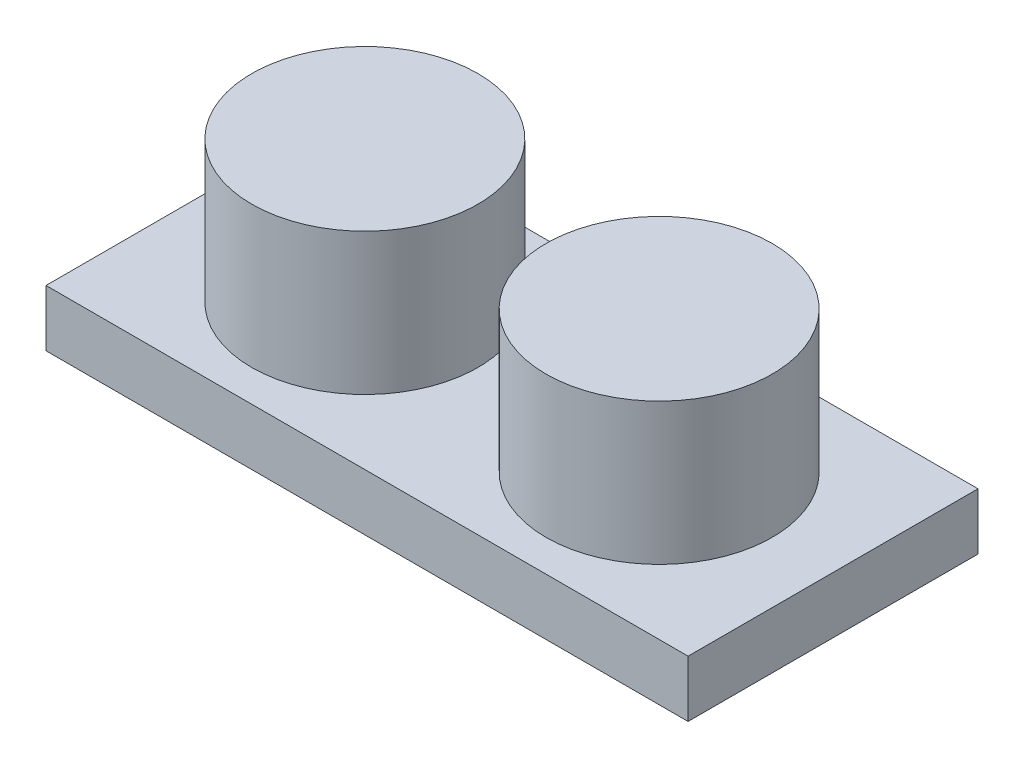
ISO-10303-21;
HEADER;
FILE_DESCRIPTION(('STEP AP214'),'2;1');
FILE_NAME('part.step','',(''),(''),'','','');
FILE_SCHEMA(('AUTOMOTIVE_DESIGN { 1 0 10303 214 1 1 1 1 }'));
ENDSEC;
DATA;
#1=APPLICATION_CONTEXT('core data for automotive mechanical design processes');
#2=APPLICATION_PROTOCOL_DEFINITION('international standard','automotive_design',2000,#1);
#3=PRODUCT_CONTEXT('',#1,'mechanical');
#4=PRODUCT('Part','Part','',(#3));
#5=PRODUCT_RELATED_PRODUCT_CATEGORY('part','',(#4));
#6=PRODUCT_DEFINITION_FORMATION('','',#4);
#7=PRODUCT_DEFINITION_CONTEXT('part definition',#1,'design');
#8=PRODUCT_DEFINITION('design','',#6,#7);
#9=PRODUCT_DEFINITION_SHAPE('','',#8);
#10=(LENGTH_UNIT() NAMED_UNIT(*) SI_UNIT(.MILLI.,.METRE.));
#11=(NAMED_UNIT(*) PLANE_ANGLE_UNIT() SI_UNIT($,.RADIAN.));
#12=(NAMED_UNIT(*) SI_UNIT($,.STERADIAN.) SOLID_ANGLE_UNIT());
#13=UNCERTAINTY_MEASURE_WITH_UNIT(LENGTH_MEASURE(1.E-05),#10,'distance_accuracy_value','');
#14=(GEOMETRIC_REPRESENTATION_CONTEXT(3) GLOBAL_UNCERTAINTY_ASSIGNED_CONTEXT((#13)) GLOBAL_UNIT_ASSIGNED_CONTEXT((#10,
#11,#12)) REPRESENTATION_CONTEXT('',''));
#15=CARTESIAN_POINT('',(0.,0.,0.));
#16=DIRECTION('',(0.,0.,1.));
#17=DIRECTION('',(1.,0.,0.));
#18=AXIS2_PLACEMENT_3D('',#15,#16,#17);
#19=CARTESIAN_POINT('',(0.,4.,-10.25));
#20=DIRECTION('',(0.,0.,-1.));
#21=DIRECTION('',(-1.,0.,0.));
#22=AXIS2_PLACEMENT_3D('',#19,#20,#21);
#23=PLANE('',#22);
#24=DIRECTION('',(1.,0.,0.));
#25=VECTOR('',#24,1.);
#26=CARTESIAN_POINT('',(0.,0.,-10.25));
#27=LINE('',#26,#25);
#28=CARTESIAN_POINT('',(-22.7,0.,-10.25));
#29=VERTEX_POINT('',#28);
#30=CARTESIAN_POINT('',(22.7,0.,-10.25));
#31=VERTEX_POINT('',#30);
#32=EDGE_CURVE('E118',#29,#31,#27,.T.);
#33=ORIENTED_EDGE('',*,*,#32,.F.);
#34=DIRECTION('',(0.,-1.,0.));
#35=VECTOR('',#34,1.);
#36=CARTESIAN_POINT('',(-22.7,4.,-10.25));
#37=LINE('',#36,#35);
#38=CARTESIAN_POINT('',(-22.7,4.,-10.25));
#39=VERTEX_POINT('',#38);
#40=EDGE_CURVE('E113',#39,#29,#37,.T.);
#41=ORIENTED_EDGE('',*,*,#40,.F.);
#42=DIRECTION('',(1.,0.,0.));
#43=VECTOR('',#42,1.);
#44=CARTESIAN_POINT('',(0.,4.,-10.25));
#45=LINE('',#44,#43);
#46=CARTESIAN_POINT('',(22.7,4.,-10.25));
#47=VERTEX_POINT('',#46);
#48=EDGE_CURVE('E116',#39,#47,#45,.T.);
#49=ORIENTED_EDGE('',*,*,#48,.T.);
#50=DIRECTION('',(0.,-1.,0.));
#51=VECTOR('',#50,1.);
#52=CARTESIAN_POINT('',(22.7,4.,-10.25));
#53=LINE('',#52,#51);
#54=EDGE_CURVE('E74',#47,#31,#53,.T.);
#55=ORIENTED_EDGE('',*,*,#54,.T.);
#56=EDGE_LOOP('',(#33,#41,#49,#55));
#57=FACE_BOUND('',#56,.T.);
#58=ADVANCED_FACE('F65',(#57),#23,.T.);
#59=CARTESIAN_POINT('',(-22.7,4.,0.));
#60=DIRECTION('',(1.,0.,0.));
#61=DIRECTION('',(0.,0.,-1.));
#62=AXIS2_PLACEMENT_3D('',#59,#60,#61);
#63=PLANE('',#62);
#64=DIRECTION('',(0.,0.,1.));
#65=VECTOR('',#64,1.);
#66=CARTESIAN_POINT('',(-22.7,0.,0.));
#67=LINE('',#66,#65);
#68=CARTESIAN_POINT('',(-22.7,0.,10.25));
#69=VERTEX_POINT('',#68);
#70=EDGE_CURVE('E98',#29,#69,#67,.T.);
#71=ORIENTED_EDGE('',*,*,#70,.T.);
#72=DIRECTION('',(0.,-1.,0.));
#73=VECTOR('',#72,1.);
#74=CARTESIAN_POINT('',(-22.7,4.,10.25));
#75=LINE('',#74,#73);
#76=CARTESIAN_POINT('',(-22.7,4.,10.25));
#77=VERTEX_POINT('',#76);
#78=EDGE_CURVE('E119',#77,#69,#75,.T.);
#79=ORIENTED_EDGE('',*,*,#78,.F.);
#80=DIRECTION('',(0.,0.,1.));
#81=VECTOR('',#80,1.);
#82=CARTESIAN_POINT('',(-22.7,4.,0.));
#83=LINE('',#82,#81);
#84=EDGE_CURVE('E121',#39,#77,#83,.T.);
#85=ORIENTED_EDGE('',*,*,#84,.F.);
#86=ORIENTED_EDGE('',*,*,#40,.T.);
#87=EDGE_LOOP('',(#71,#79,#85,#86));
#88=FACE_BOUND('',#87,.T.);
#89=ADVANCED_FACE('F122',(#88),#63,.F.);
#90=CARTESIAN_POINT('',(0.,4.,10.25));
#91=DIRECTION('',(0.,0.,-1.));
#92=DIRECTION('',(-1.,0.,0.));
#93=AXIS2_PLACEMENT_3D('',#90,#91,#92);
#94=PLANE('',#93);
#95=DIRECTION('',(1.,0.,0.));
#96=VECTOR('',#95,1.);
#97=CARTESIAN_POINT('',(0.,0.,10.25));
#98=LINE('',#97,#96);
#99=CARTESIAN_POINT('',(22.7,0.,10.25));
#100=VERTEX_POINT('',#99);
#101=EDGE_CURVE('E127',#69,#100,#98,.T.);
#102=ORIENTED_EDGE('',*,*,#101,.T.);
#103=DIRECTION('',(0.,-1.,0.));
#104=VECTOR('',#103,1.);
#105=CARTESIAN_POINT('',(22.7,4.,10.25));
#106=LINE('',#105,#104);
#107=CARTESIAN_POINT('',(22.7,4.,10.25));
#108=VERTEX_POINT('',#107);
#109=EDGE_CURVE('E105',#108,#100,#106,.T.);
#110=ORIENTED_EDGE('',*,*,#109,.F.);
#111=DIRECTION('',(1.,0.,0.));
#112=VECTOR('',#111,1.);
#113=CARTESIAN_POINT('',(0.,4.,10.25));
#114=LINE('',#113,#112);
#115=EDGE_CURVE('E82',#77,#108,#114,.T.);
#116=ORIENTED_EDGE('',*,*,#115,.F.);
#117=ORIENTED_EDGE('',*,*,#78,.T.);
#118=EDGE_LOOP('',(#102,#110,#116,#117));
#119=FACE_BOUND('',#118,.T.);
#120=ADVANCED_FACE('F168',(#119),#94,.F.);
#121=CARTESIAN_POINT('',(22.7,4.,0.));
#122=DIRECTION('',(1.,0.,0.));
#123=DIRECTION('',(0.,0.,-1.));
#124=AXIS2_PLACEMENT_3D('',#121,#122,#123);
#125=PLANE('',#124);
#126=DIRECTION('',(0.,0.,1.));
#127=VECTOR('',#126,1.);
#128=CARTESIAN_POINT('',(22.7,0.,0.));
#129=LINE('',#128,#127);
#130=EDGE_CURVE('E132',#31,#100,#129,.T.);
#131=ORIENTED_EDGE('',*,*,#130,.F.);
#132=ORIENTED_EDGE('',*,*,#54,.F.);
#133=DIRECTION('',(0.,0.,1.));
#134=VECTOR('',#133,1.);
#135=CARTESIAN_POINT('',(22.7,4.,0.));
#136=LINE('',#135,#134);
#137=EDGE_CURVE('E125',#47,#108,#136,.T.);
#138=ORIENTED_EDGE('',*,*,#137,.T.);
#139=ORIENTED_EDGE('',*,*,#109,.T.);
#140=EDGE_LOOP('',(#131,#132,#138,#139));
#141=FACE_BOUND('',#140,.T.);
#142=ADVANCED_FACE('F67',(#141),#125,.T.);
#143=CARTESIAN_POINT('',(0.,0.,0.));
#144=DIRECTION('',(0.,1.,0.));
#145=DIRECTION('',(0.,0.,1.));
#146=AXIS2_PLACEMENT_3D('',#143,#144,#145);
#147=PLANE('',#146);
#148=ORIENTED_EDGE('',*,*,#130,.T.);
#149=ORIENTED_EDGE('',*,*,#101,.F.);
#150=ORIENTED_EDGE('',*,*,#70,.F.);
#151=ORIENTED_EDGE('',*,*,#32,.T.);
#152=EDGE_LOOP('',(#148,#149,#150,#151));
#153=FACE_BOUND('',#152,.T.);
#154=ADVANCED_FACE('F174',(#153),#147,.F.);
#155=CARTESIAN_POINT('',(0.,4.,0.));
#156=DIRECTION('',(0.,1.,0.));
#157=DIRECTION('',(0.,0.,1.));
#158=AXIS2_PLACEMENT_3D('',#155,#156,#157);
#159=PLANE('',#158);
#160=CARTESIAN_POINT('',(10.4041666666667,4.,0.));
#161=DIRECTION('',(0.,1.,0.));
#162=DIRECTION('',(0.,0.,1.));
#163=AXIS2_PLACEMENT_3D('',#160,#161,#162);
#164=CIRCLE('',#163,8.);
#165=CARTESIAN_POINT('',(10.4041666666667,4.,8.));
#166=VERTEX_POINT('',#165);
#167=EDGE_CURVE('E12',#166,#166,#164,.T.);
#168=ORIENTED_EDGE('',*,*,#167,.F.);
#169=EDGE_LOOP('',(#168));
#170=FACE_BOUND('',#169,.T.);
#171=CARTESIAN_POINT('',(-10.4041666666667,4.,0.));
#172=DIRECTION('',(0.,1.,0.));
#173=DIRECTION('',(0.,0.,1.));
#174=AXIS2_PLACEMENT_3D('',#171,#172,#173);
#175=CIRCLE('',#174,8.);
#176=CARTESIAN_POINT('',(-10.4041666666667,4.,8.));
#177=VERTEX_POINT('',#176);
#178=EDGE_CURVE('E135',#177,#177,#175,.F.);
#179=ORIENTED_EDGE('',*,*,#178,.T.);
#180=EDGE_LOOP('',(#179));
#181=FACE_BOUND('',#180,.T.);
#182=ORIENTED_EDGE('',*,*,#137,.F.);
#183=ORIENTED_EDGE('',*,*,#48,.F.);
#184=ORIENTED_EDGE('',*,*,#84,.T.);
#185=ORIENTED_EDGE('',*,*,#115,.T.);
#186=EDGE_LOOP('',(#182,#183,#184,#185));
#187=FACE_BOUND('',#186,.T.);
#188=ADVANCED_FACE('F124',(#170,#181,#187),#159,.T.);
#189=CARTESIAN_POINT('',(-10.4041666666667,14.,0.));
#190=DIRECTION('',(0.,-1.,0.));
#191=DIRECTION('',(0.,0.,-1.));
#192=AXIS2_PLACEMENT_3D('',#189,#190,#191);
#193=CYLINDRICAL_SURFACE('',#192,8.);
#194=ORIENTED_EDGE('',*,*,#178,.F.);
#195=EDGE_LOOP('',(#194));
#196=FACE_BOUND('',#195,.T.);
#197=CARTESIAN_POINT('',(-10.4041666666667,14.,0.));
#198=DIRECTION('',(0.,1.,0.));
#199=DIRECTION('',(0.,0.,1.));
#200=AXIS2_PLACEMENT_3D('',#197,#198,#199);
#201=CIRCLE('',#200,8.);
#202=CARTESIAN_POINT('',(-10.4041666666667,14.,8.));
#203=VERTEX_POINT('',#202);
#204=EDGE_CURVE('E142',#203,#203,#201,.T.);
#205=ORIENTED_EDGE('',*,*,#204,.F.);
#206=EDGE_LOOP('',(#205));
#207=FACE_BOUND('',#206,.T.);
#208=ADVANCED_FACE('F180',(#196,#207),#193,.T.);
#209=CARTESIAN_POINT('',(0.,14.,0.));
#210=DIRECTION('',(0.,1.,0.));
#211=DIRECTION('',(0.,0.,1.));
#212=AXIS2_PLACEMENT_3D('',#209,#210,#211);
#213=PLANE('',#212);
#214=ORIENTED_EDGE('',*,*,#204,.T.);
#215=EDGE_LOOP('',(#214));
#216=FACE_BOUND('',#215,.T.);
#217=ADVANCED_FACE('F161',(#216),#213,.T.);
#218=CARTESIAN_POINT('',(10.4041666666667,14.,0.));
#219=DIRECTION('',(0.,-1.,0.));
#220=DIRECTION('',(0.,0.,-1.));
#221=AXIS2_PLACEMENT_3D('',#218,#219,#220);
#222=CYLINDRICAL_SURFACE('',#221,8.);
#223=ORIENTED_EDGE('',*,*,#167,.T.);
#224=EDGE_LOOP('',(#223));
#225=FACE_BOUND('',#224,.T.);
#226=CARTESIAN_POINT('',(10.4041666666667,14.,0.));
#227=DIRECTION('',(0.,1.,0.));
#228=DIRECTION('',(0.,0.,1.));
#229=AXIS2_PLACEMENT_3D('',#226,#227,#228);
#230=CIRCLE('',#229,8.);
#231=CARTESIAN_POINT('',(10.4041666666667,14.,8.));
#232=VERTEX_POINT('',#231);
#233=EDGE_CURVE('E146',#232,#232,#230,.F.);
#234=ORIENTED_EDGE('',*,*,#233,.T.);
#235=EDGE_LOOP('',(#234));
#236=FACE_BOUND('',#235,.T.);
#237=ADVANCED_FACE('F153',(#225,#236),#222,.T.);
#238=CARTESIAN_POINT('',(0.,14.,0.));
#239=DIRECTION('',(0.,1.,0.));
#240=DIRECTION('',(0.,0.,1.));
#241=AXIS2_PLACEMENT_3D('',#238,#239,#240);
#242=PLANE('',#241);
#243=ORIENTED_EDGE('',*,*,#233,.F.);
#244=EDGE_LOOP('',(#243));
#245=FACE_BOUND('',#244,.T.);
#246=ADVANCED_FACE('F155',(#245),#242,.T.);
#247=CLOSED_SHELL('',(#58,#89,#120,#142,#154,#188,#208,#217,#237,#246));
#248=MANIFOLD_SOLID_BREP('B2',#247);
#249=ADVANCED_BREP_SHAPE_REPRESENTATION('',(#18,#248),#14);
#250=SHAPE_DEFINITION_REPRESENTATION(#9,#249);
ENDSEC;
END-ISO-10303-21;
